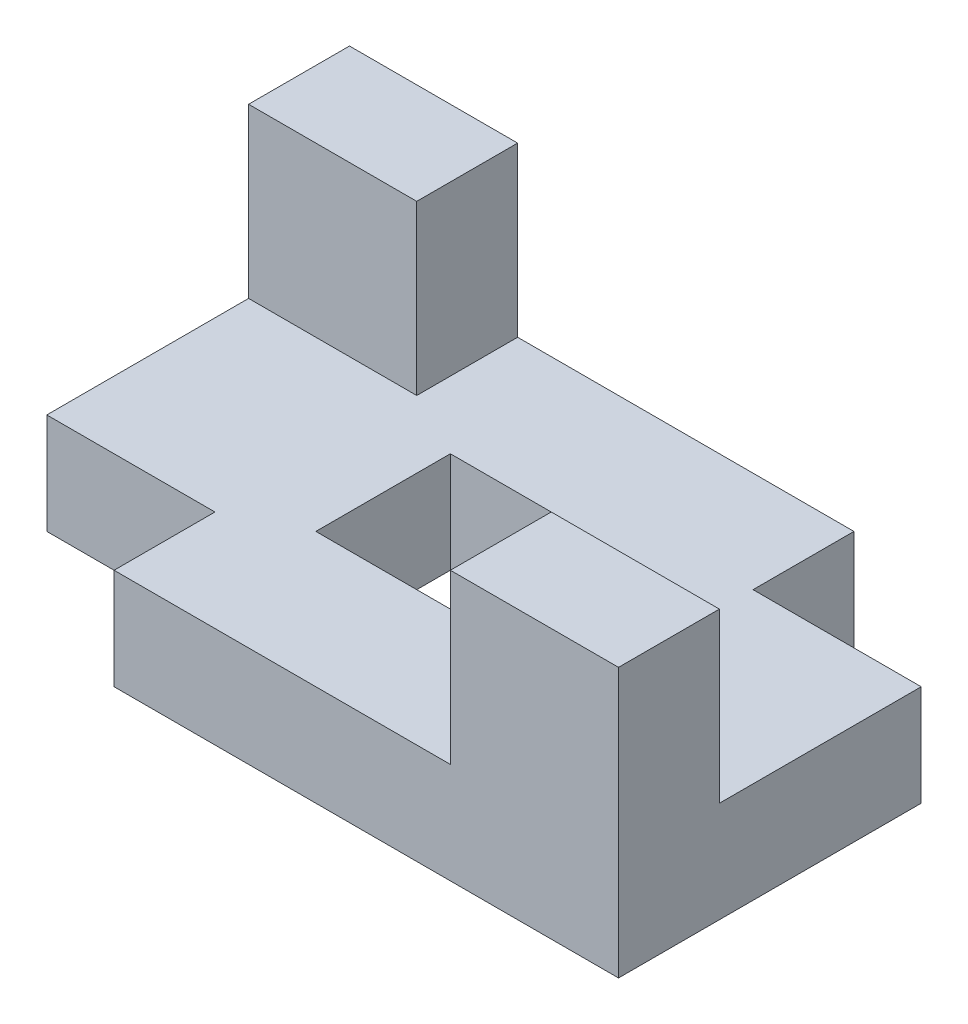
ISO-10303-21;
HEADER;
FILE_DESCRIPTION(('STEP AP214'),'2;1');
FILE_NAME('part.step','',(''),(''),'','','');
FILE_SCHEMA(('AUTOMOTIVE_DESIGN { 1 0 10303 214 1 1 1 1 }'));
ENDSEC;
DATA;
#1=APPLICATION_CONTEXT('core data for automotive mechanical design processes');
#2=APPLICATION_PROTOCOL_DEFINITION('international standard','automotive_design',2000,#1);
#3=PRODUCT_CONTEXT('',#1,'mechanical');
#4=PRODUCT('Part','Part','',(#3));
#5=PRODUCT_RELATED_PRODUCT_CATEGORY('part','',(#4));
#6=PRODUCT_DEFINITION_FORMATION('','',#4);
#7=PRODUCT_DEFINITION_CONTEXT('part definition',#1,'design');
#8=PRODUCT_DEFINITION('design','',#6,#7);
#9=PRODUCT_DEFINITION_SHAPE('','',#8);
#10=(LENGTH_UNIT() NAMED_UNIT(*) SI_UNIT(.MILLI.,.METRE.));
#11=(NAMED_UNIT(*) PLANE_ANGLE_UNIT() SI_UNIT($,.RADIAN.));
#12=(NAMED_UNIT(*) SI_UNIT($,.STERADIAN.) SOLID_ANGLE_UNIT());
#13=UNCERTAINTY_MEASURE_WITH_UNIT(LENGTH_MEASURE(1.E-05),#10,'distance_accuracy_value','');
#14=(GEOMETRIC_REPRESENTATION_CONTEXT(3) GLOBAL_UNCERTAINTY_ASSIGNED_CONTEXT((#13)) GLOBAL_UNIT_ASSIGNED_CONTEXT((#10,
#11,#12)) REPRESENTATION_CONTEXT('',''));
#15=CARTESIAN_POINT('',(0.,0.,0.));
#16=DIRECTION('',(0.,0.,1.));
#17=DIRECTION('',(1.,0.,0.));
#18=AXIS2_PLACEMENT_3D('',#15,#16,#17);
#19=CARTESIAN_POINT('',(0.,15.,0.));
#20=DIRECTION('',(0.,1.,0.));
#21=DIRECTION('',(0.,0.,1.));
#22=AXIS2_PLACEMENT_3D('',#19,#20,#21);
#23=PLANE('',#22);
#24=DIRECTION('',(0.,0.,1.));
#25=VECTOR('',#24,1.);
#26=CARTESIAN_POINT('',(-15.,15.,-9.99999999999999));
#27=LINE('',#26,#25);
#28=CARTESIAN_POINT('',(-15.,15.,-9.99999999999999));
#29=VERTEX_POINT('',#28);
#30=CARTESIAN_POINT('',(-15.,15.,10.));
#31=VERTEX_POINT('',#30);
#32=EDGE_CURVE('E61',#29,#31,#27,.T.);
#33=ORIENTED_EDGE('',*,*,#32,.F.);
#34=DIRECTION('',(-1.,0.,0.));
#35=VECTOR('',#34,1.);
#36=CARTESIAN_POINT('',(-15.,15.,-9.99999999999999));
#37=LINE('',#36,#35);
#38=CARTESIAN_POINT('',(15.,15.,-9.99999999999999));
#39=VERTEX_POINT('',#38);
#40=EDGE_CURVE('E191',#39,#29,#37,.T.);
#41=ORIENTED_EDGE('',*,*,#40,.F.);
#42=DIRECTION('',(0.,0.,-1.));
#43=VECTOR('',#42,1.);
#44=CARTESIAN_POINT('',(15.,15.,-9.99999999999999));
#45=LINE('',#44,#43);
#46=CARTESIAN_POINT('',(15.,15.,10.));
#47=VERTEX_POINT('',#46);
#48=EDGE_CURVE('E174',#47,#39,#45,.T.);
#49=ORIENTED_EDGE('',*,*,#48,.F.);
#50=DIRECTION('',(1.,0.,0.));
#51=VECTOR('',#50,1.);
#52=CARTESIAN_POINT('',(-15.,15.,10.));
#53=LINE('',#52,#51);
#54=EDGE_CURVE('E184',#31,#47,#53,.T.);
#55=ORIENTED_EDGE('',*,*,#54,.F.);
#56=EDGE_LOOP('',(#33,#41,#49,#55));
#57=FACE_BOUND('',#56,.T.);
#58=DIRECTION('',(0.,0.,-1.));
#59=VECTOR('',#58,1.);
#60=CARTESIAN_POINT('',(50.,15.,-30.));
#61=LINE('',#60,#59);
#62=CARTESIAN_POINT('',(50.,15.,15.));
#63=VERTEX_POINT('',#62);
#64=CARTESIAN_POINT('',(50.,15.,-15.));
#65=VERTEX_POINT('',#64);
#66=EDGE_CURVE('E320',#63,#65,#61,.T.);
#67=ORIENTED_EDGE('',*,*,#66,.T.);
#68=DIRECTION('',(-1.,0.,0.));
#69=VECTOR('',#68,1.);
#70=CARTESIAN_POINT('',(50.,15.,-15.));
#71=LINE('',#70,#69);
#72=CARTESIAN_POINT('',(25.,15.,-15.));
#73=VERTEX_POINT('',#72);
#74=EDGE_CURVE('E209',#65,#73,#71,.T.);
#75=ORIENTED_EDGE('',*,*,#74,.T.);
#76=DIRECTION('',(0.,0.,1.));
#77=VECTOR('',#76,1.);
#78=CARTESIAN_POINT('',(25.,15.,-30.));
#79=LINE('',#78,#77);
#80=CARTESIAN_POINT('',(25.,15.,-30.));
#81=VERTEX_POINT('',#80);
#82=EDGE_CURVE('E201',#81,#73,#79,.T.);
#83=ORIENTED_EDGE('',*,*,#82,.F.);
#84=DIRECTION('',(-1.,0.,0.));
#85=VECTOR('',#84,1.);
#86=CARTESIAN_POINT('',(-50.,15.,-30.));
#87=LINE('',#86,#85);
#88=CARTESIAN_POINT('',(-25.,15.,-30.));
#89=VERTEX_POINT('',#88);
#90=EDGE_CURVE('E324',#81,#89,#87,.T.);
#91=ORIENTED_EDGE('',*,*,#90,.T.);
#92=DIRECTION('',(0.,0.,1.));
#93=VECTOR('',#92,1.);
#94=CARTESIAN_POINT('',(-25.,15.,-30.));
#95=LINE('',#94,#93);
#96=CARTESIAN_POINT('',(-25.,15.,-15.));
#97=VERTEX_POINT('',#96);
#98=EDGE_CURVE('E271',#89,#97,#95,.T.);
#99=ORIENTED_EDGE('',*,*,#98,.T.);
#100=DIRECTION('',(1.,0.,0.));
#101=VECTOR('',#100,1.);
#102=CARTESIAN_POINT('',(-50.,15.,-15.));
#103=LINE('',#102,#101);
#104=CARTESIAN_POINT('',(-50.,15.,-15.));
#105=VERTEX_POINT('',#104);
#106=EDGE_CURVE('E284',#105,#97,#103,.T.);
#107=ORIENTED_EDGE('',*,*,#106,.F.);
#108=DIRECTION('',(0.,0.,1.));
#109=VECTOR('',#108,1.);
#110=CARTESIAN_POINT('',(-50.,15.,-30.));
#111=LINE('',#110,#109);
#112=CARTESIAN_POINT('',(-50.,15.,15.));
#113=VERTEX_POINT('',#112);
#114=EDGE_CURVE('E312',#105,#113,#111,.T.);
#115=ORIENTED_EDGE('',*,*,#114,.T.);
#116=DIRECTION('',(1.,0.,0.));
#117=VECTOR('',#116,1.);
#118=CARTESIAN_POINT('',(-50.,15.,15.));
#119=LINE('',#118,#117);
#120=CARTESIAN_POINT('',(-25.,15.,15.));
#121=VERTEX_POINT('',#120);
#122=EDGE_CURVE('E231',#113,#121,#119,.T.);
#123=ORIENTED_EDGE('',*,*,#122,.T.);
#124=DIRECTION('',(0.,0.,-1.));
#125=VECTOR('',#124,1.);
#126=CARTESIAN_POINT('',(-25.,15.,30.));
#127=LINE('',#126,#125);
#128=CARTESIAN_POINT('',(-25.,15.,30.));
#129=VERTEX_POINT('',#128);
#130=EDGE_CURVE('E227',#129,#121,#127,.T.);
#131=ORIENTED_EDGE('',*,*,#130,.F.);
#132=DIRECTION('',(1.,0.,0.));
#133=VECTOR('',#132,1.);
#134=CARTESIAN_POINT('',(-50.,15.,30.));
#135=LINE('',#134,#133);
#136=CARTESIAN_POINT('',(25.,15.,30.));
#137=VERTEX_POINT('',#136);
#138=EDGE_CURVE('E316',#129,#137,#135,.T.);
#139=ORIENTED_EDGE('',*,*,#138,.T.);
#140=DIRECTION('',(0.,0.,-1.));
#141=VECTOR('',#140,1.);
#142=CARTESIAN_POINT('',(25.,15.,30.));
#143=LINE('',#142,#141);
#144=CARTESIAN_POINT('',(25.,15.,15.));
#145=VERTEX_POINT('',#144);
#146=EDGE_CURVE('E240',#137,#145,#143,.T.);
#147=ORIENTED_EDGE('',*,*,#146,.T.);
#148=DIRECTION('',(-1.,0.,0.));
#149=VECTOR('',#148,1.);
#150=CARTESIAN_POINT('',(50.,15.,15.));
#151=LINE('',#150,#149);
#152=EDGE_CURVE('E251',#63,#145,#151,.T.);
#153=ORIENTED_EDGE('',*,*,#152,.F.);
#154=EDGE_LOOP('',(#67,#75,#83,#91,#99,#107,#115,#123,#131,#139,#147,#153));
#155=FACE_BOUND('',#154,.T.);
#156=ADVANCED_FACE('F45',(#57,#155),#23,.T.);
#157=CARTESIAN_POINT('',(0.,0.,0.));
#158=DIRECTION('',(0.,1.,0.));
#159=DIRECTION('',(0.,0.,1.));
#160=AXIS2_PLACEMENT_3D('',#157,#158,#159);
#161=PLANE('',#160);
#162=DIRECTION('',(-1.,0.,0.));
#163=VECTOR('',#162,1.);
#164=CARTESIAN_POINT('',(0.,0.,-9.99999999999999));
#165=LINE('',#164,#163);
#166=CARTESIAN_POINT('',(15.,0.,-9.99999999999999));
#167=VERTEX_POINT('',#166);
#168=CARTESIAN_POINT('',(-15.,0.,-9.99999999999999));
#169=VERTEX_POINT('',#168);
#170=EDGE_CURVE('E54',#167,#169,#165,.T.);
#171=ORIENTED_EDGE('',*,*,#170,.T.);
#172=DIRECTION('',(0.,0.,1.));
#173=VECTOR('',#172,1.);
#174=CARTESIAN_POINT('',(-15.,0.,0.));
#175=LINE('',#174,#173);
#176=CARTESIAN_POINT('',(-15.,0.,10.));
#177=VERTEX_POINT('',#176);
#178=EDGE_CURVE('E11',#169,#177,#175,.T.);
#179=ORIENTED_EDGE('',*,*,#178,.T.);
#180=DIRECTION('',(1.,0.,0.));
#181=VECTOR('',#180,1.);
#182=CARTESIAN_POINT('',(0.,0.,10.));
#183=LINE('',#182,#181);
#184=CARTESIAN_POINT('',(15.,0.,10.));
#185=VERTEX_POINT('',#184);
#186=EDGE_CURVE('E359',#177,#185,#183,.T.);
#187=ORIENTED_EDGE('',*,*,#186,.T.);
#188=DIRECTION('',(0.,0.,-1.));
#189=VECTOR('',#188,1.);
#190=CARTESIAN_POINT('',(15.,0.,0.));
#191=LINE('',#190,#189);
#192=EDGE_CURVE('E177',#185,#167,#191,.T.);
#193=ORIENTED_EDGE('',*,*,#192,.T.);
#194=EDGE_LOOP('',(#171,#179,#187,#193));
#195=FACE_BOUND('',#194,.T.);
#196=DIRECTION('',(-1.,0.,0.));
#197=VECTOR('',#196,1.);
#198=CARTESIAN_POINT('',(0.,0.,-15.));
#199=LINE('',#198,#197);
#200=CARTESIAN_POINT('',(50.,0.,-15.));
#201=VERTEX_POINT('',#200);
#202=CARTESIAN_POINT('',(25.,0.,-15.));
#203=VERTEX_POINT('',#202);
#204=EDGE_CURVE('E224',#201,#203,#199,.T.);
#205=ORIENTED_EDGE('',*,*,#204,.F.);
#206=DIRECTION('',(0.,0.,-1.));
#207=VECTOR('',#206,1.);
#208=CARTESIAN_POINT('',(50.,0.,-30.));
#209=LINE('',#208,#207);
#210=CARTESIAN_POINT('',(50.,0.,30.));
#211=VERTEX_POINT('',#210);
#212=EDGE_CURVE('E334',#211,#201,#209,.T.);
#213=ORIENTED_EDGE('',*,*,#212,.F.);
#214=DIRECTION('',(1.,0.,0.));
#215=VECTOR('',#214,1.);
#216=CARTESIAN_POINT('',(-50.,0.,30.));
#217=LINE('',#216,#215);
#218=CARTESIAN_POINT('',(-25.,0.,30.));
#219=VERTEX_POINT('',#218);
#220=EDGE_CURVE('E331',#219,#211,#217,.T.);
#221=ORIENTED_EDGE('',*,*,#220,.F.);
#222=DIRECTION('',(0.,0.,-1.));
#223=VECTOR('',#222,1.);
#224=CARTESIAN_POINT('',(-25.,0.,0.));
#225=LINE('',#224,#223);
#226=CARTESIAN_POINT('',(-25.,0.,15.));
#227=VERTEX_POINT('',#226);
#228=EDGE_CURVE('E347',#219,#227,#225,.T.);
#229=ORIENTED_EDGE('',*,*,#228,.T.);
#230=DIRECTION('',(1.,0.,0.));
#231=VECTOR('',#230,1.);
#232=CARTESIAN_POINT('',(0.,0.,15.));
#233=LINE('',#232,#231);
#234=CARTESIAN_POINT('',(-50.,0.,15.));
#235=VERTEX_POINT('',#234);
#236=EDGE_CURVE('E351',#235,#227,#233,.T.);
#237=ORIENTED_EDGE('',*,*,#236,.F.);
#238=DIRECTION('',(0.,0.,1.));
#239=VECTOR('',#238,1.);
#240=CARTESIAN_POINT('',(-50.,0.,-30.));
#241=LINE('',#240,#239);
#242=CARTESIAN_POINT('',(-50.,0.,-30.));
#243=VERTEX_POINT('',#242);
#244=EDGE_CURVE('E304',#243,#235,#241,.T.);
#245=ORIENTED_EDGE('',*,*,#244,.F.);
#246=DIRECTION('',(-1.,0.,0.));
#247=VECTOR('',#246,1.);
#248=CARTESIAN_POINT('',(-50.,0.,-30.));
#249=LINE('',#248,#247);
#250=CARTESIAN_POINT('',(25.,0.,-30.));
#251=VERTEX_POINT('',#250);
#252=EDGE_CURVE('E317',#251,#243,#249,.T.);
#253=ORIENTED_EDGE('',*,*,#252,.F.);
#254=DIRECTION('',(0.,0.,1.));
#255=VECTOR('',#254,1.);
#256=CARTESIAN_POINT('',(25.,0.,0.));
#257=LINE('',#256,#255);
#258=EDGE_CURVE('E218',#251,#203,#257,.T.);
#259=ORIENTED_EDGE('',*,*,#258,.T.);
#260=EDGE_LOOP('',(#205,#213,#221,#229,#237,#245,#253,#259));
#261=FACE_BOUND('',#260,.T.);
#262=ADVANCED_FACE('F366',(#195,#261),#161,.F.);
#263=CARTESIAN_POINT('',(50.,15.,-30.));
#264=DIRECTION('',(-1.,0.,0.));
#265=DIRECTION('',(0.,0.,1.));
#266=AXIS2_PLACEMENT_3D('',#263,#264,#265);
#267=PLANE('',#266);
#268=DIRECTION('',(0.,1.,0.));
#269=VECTOR('',#268,1.);
#270=CARTESIAN_POINT('',(50.,-10.,-15.));
#271=LINE('',#270,#269);
#272=EDGE_CURVE('E214',#201,#65,#271,.T.);
#273=ORIENTED_EDGE('',*,*,#272,.T.);
#274=ORIENTED_EDGE('',*,*,#66,.F.);
#275=DIRECTION('',(0.,-1.,0.));
#276=VECTOR('',#275,1.);
#277=CARTESIAN_POINT('',(50.,40.,15.));
#278=LINE('',#277,#276);
#279=CARTESIAN_POINT('',(50.,40.,15.));
#280=VERTEX_POINT('',#279);
#281=EDGE_CURVE('E267',#280,#63,#278,.T.);
#282=ORIENTED_EDGE('',*,*,#281,.F.);
#283=DIRECTION('',(0.,0.,-1.));
#284=VECTOR('',#283,1.);
#285=CARTESIAN_POINT('',(50.,40.,30.));
#286=LINE('',#285,#284);
#287=CARTESIAN_POINT('',(50.,40.,30.));
#288=VERTEX_POINT('',#287);
#289=EDGE_CURVE('E258',#288,#280,#286,.T.);
#290=ORIENTED_EDGE('',*,*,#289,.F.);
#291=DIRECTION('',(0.,-1.,0.));
#292=VECTOR('',#291,1.);
#293=CARTESIAN_POINT('',(50.,15.,30.));
#294=LINE('',#293,#292);
#295=EDGE_CURVE('E343',#288,#211,#294,.T.);
#296=ORIENTED_EDGE('',*,*,#295,.T.);
#297=ORIENTED_EDGE('',*,*,#212,.T.);
#298=EDGE_LOOP('',(#273,#274,#282,#290,#296,#297));
#299=FACE_BOUND('',#298,.T.);
#300=ADVANCED_FACE('F390',(#299),#267,.F.);
#301=CARTESIAN_POINT('',(-50.,15.,-30.));
#302=DIRECTION('',(1.,0.,0.));
#303=DIRECTION('',(0.,0.,-1.));
#304=AXIS2_PLACEMENT_3D('',#301,#302,#303);
#305=PLANE('',#304);
#306=DIRECTION('',(0.,1.,0.));
#307=VECTOR('',#306,1.);
#308=CARTESIAN_POINT('',(-50.,-10.,15.));
#309=LINE('',#308,#307);
#310=EDGE_CURVE('E236',#235,#113,#309,.T.);
#311=ORIENTED_EDGE('',*,*,#310,.T.);
#312=ORIENTED_EDGE('',*,*,#114,.F.);
#313=DIRECTION('',(0.,-1.,0.));
#314=VECTOR('',#313,1.);
#315=CARTESIAN_POINT('',(-50.,40.,-15.));
#316=LINE('',#315,#314);
#317=CARTESIAN_POINT('',(-50.,40.,-15.));
#318=VERTEX_POINT('',#317);
#319=EDGE_CURVE('E300',#318,#105,#316,.T.);
#320=ORIENTED_EDGE('',*,*,#319,.F.);
#321=DIRECTION('',(0.,0.,1.));
#322=VECTOR('',#321,1.);
#323=CARTESIAN_POINT('',(-50.,40.,-30.));
#324=LINE('',#323,#322);
#325=CARTESIAN_POINT('',(-50.,40.,-30.));
#326=VERTEX_POINT('',#325);
#327=EDGE_CURVE('E291',#326,#318,#324,.T.);
#328=ORIENTED_EDGE('',*,*,#327,.F.);
#329=DIRECTION('',(0.,-1.,0.));
#330=VECTOR('',#329,1.);
#331=CARTESIAN_POINT('',(-50.,15.,-30.));
#332=LINE('',#331,#330);
#333=EDGE_CURVE('E327',#326,#243,#332,.T.);
#334=ORIENTED_EDGE('',*,*,#333,.T.);
#335=ORIENTED_EDGE('',*,*,#244,.T.);
#336=EDGE_LOOP('',(#311,#312,#320,#328,#334,#335));
#337=FACE_BOUND('',#336,.T.);
#338=ADVANCED_FACE('F47',(#337),#305,.F.);
#339=CARTESIAN_POINT('',(-50.,15.,30.));
#340=DIRECTION('',(0.,0.,-1.));
#341=DIRECTION('',(-1.,0.,0.));
#342=AXIS2_PLACEMENT_3D('',#339,#340,#341);
#343=PLANE('',#342);
#344=ORIENTED_EDGE('',*,*,#138,.F.);
#345=DIRECTION('',(0.,1.,0.));
#346=VECTOR('',#345,1.);
#347=CARTESIAN_POINT('',(-25.,-10.,30.));
#348=LINE('',#347,#346);
#349=EDGE_CURVE('E235',#219,#129,#348,.T.);
#350=ORIENTED_EDGE('',*,*,#349,.F.);
#351=ORIENTED_EDGE('',*,*,#220,.T.);
#352=ORIENTED_EDGE('',*,*,#295,.F.);
#353=DIRECTION('',(-1.,0.,0.));
#354=VECTOR('',#353,1.);
#355=CARTESIAN_POINT('',(50.,40.,30.));
#356=LINE('',#355,#354);
#357=CARTESIAN_POINT('',(25.,40.,30.));
#358=VERTEX_POINT('',#357);
#359=EDGE_CURVE('E246',#288,#358,#356,.T.);
#360=ORIENTED_EDGE('',*,*,#359,.T.);
#361=DIRECTION('',(0.,-1.,0.));
#362=VECTOR('',#361,1.);
#363=CARTESIAN_POINT('',(25.,40.,30.));
#364=LINE('',#363,#362);
#365=EDGE_CURVE('E261',#358,#137,#364,.T.);
#366=ORIENTED_EDGE('',*,*,#365,.T.);
#367=EDGE_LOOP('',(#344,#350,#351,#352,#360,#366));
#368=FACE_BOUND('',#367,.T.);
#369=ADVANCED_FACE('F400',(#368),#343,.F.);
#370=CARTESIAN_POINT('',(-50.,15.,-30.));
#371=DIRECTION('',(0.,0.,1.));
#372=DIRECTION('',(1.,0.,0.));
#373=AXIS2_PLACEMENT_3D('',#370,#371,#372);
#374=PLANE('',#373);
#375=ORIENTED_EDGE('',*,*,#90,.F.);
#376=DIRECTION('',(0.,-1.,0.));
#377=VECTOR('',#376,1.);
#378=CARTESIAN_POINT('',(25.,15.,-30.));
#379=LINE('',#378,#377);
#380=EDGE_CURVE('E355',#81,#251,#379,.T.);
#381=ORIENTED_EDGE('',*,*,#380,.T.);
#382=ORIENTED_EDGE('',*,*,#252,.T.);
#383=ORIENTED_EDGE('',*,*,#333,.F.);
#384=DIRECTION('',(1.,0.,0.));
#385=VECTOR('',#384,1.);
#386=CARTESIAN_POINT('',(-50.,40.,-30.));
#387=LINE('',#386,#385);
#388=CARTESIAN_POINT('',(-25.,40.,-30.));
#389=VERTEX_POINT('',#388);
#390=EDGE_CURVE('E279',#326,#389,#387,.T.);
#391=ORIENTED_EDGE('',*,*,#390,.T.);
#392=DIRECTION('',(0.,-1.,0.));
#393=VECTOR('',#392,1.);
#394=CARTESIAN_POINT('',(-25.,40.,-30.));
#395=LINE('',#394,#393);
#396=EDGE_CURVE('E294',#389,#89,#395,.T.);
#397=ORIENTED_EDGE('',*,*,#396,.T.);
#398=EDGE_LOOP('',(#375,#381,#382,#383,#391,#397));
#399=FACE_BOUND('',#398,.T.);
#400=ADVANCED_FACE('F396',(#399),#374,.F.);
#401=CARTESIAN_POINT('',(-50.,40.,-15.));
#402=DIRECTION('',(0.,0.,-1.));
#403=DIRECTION('',(-1.,0.,0.));
#404=AXIS2_PLACEMENT_3D('',#401,#402,#403);
#405=PLANE('',#404);
#406=ORIENTED_EDGE('',*,*,#106,.T.);
#407=DIRECTION('',(0.,-1.,0.));
#408=VECTOR('',#407,1.);
#409=CARTESIAN_POINT('',(-25.,40.,-15.));
#410=LINE('',#409,#408);
#411=CARTESIAN_POINT('',(-25.,40.,-15.));
#412=VERTEX_POINT('',#411);
#413=EDGE_CURVE('E305',#412,#97,#410,.T.);
#414=ORIENTED_EDGE('',*,*,#413,.F.);
#415=DIRECTION('',(1.,0.,0.));
#416=VECTOR('',#415,1.);
#417=CARTESIAN_POINT('',(-50.,40.,-15.));
#418=LINE('',#417,#416);
#419=EDGE_CURVE('E288',#318,#412,#418,.T.);
#420=ORIENTED_EDGE('',*,*,#419,.F.);
#421=ORIENTED_EDGE('',*,*,#319,.T.);
#422=EDGE_LOOP('',(#406,#414,#420,#421));
#423=FACE_BOUND('',#422,.T.);
#424=ADVANCED_FACE('F399',(#423),#405,.F.);
#425=CARTESIAN_POINT('',(-25.,40.,-30.));
#426=DIRECTION('',(1.,0.,0.));
#427=DIRECTION('',(0.,0.,-1.));
#428=AXIS2_PLACEMENT_3D('',#425,#426,#427);
#429=PLANE('',#428);
#430=ORIENTED_EDGE('',*,*,#98,.F.);
#431=ORIENTED_EDGE('',*,*,#396,.F.);
#432=DIRECTION('',(0.,0.,1.));
#433=VECTOR('',#432,1.);
#434=CARTESIAN_POINT('',(-25.,40.,-30.));
#435=LINE('',#434,#433);
#436=EDGE_CURVE('E283',#389,#412,#435,.T.);
#437=ORIENTED_EDGE('',*,*,#436,.T.);
#438=ORIENTED_EDGE('',*,*,#413,.T.);
#439=EDGE_LOOP('',(#430,#431,#437,#438));
#440=FACE_BOUND('',#439,.T.);
#441=ADVANCED_FACE('F393',(#440),#429,.T.);
#442=CARTESIAN_POINT('',(0.,40.,0.));
#443=DIRECTION('',(0.,-1.,0.));
#444=DIRECTION('',(0.,0.,-1.));
#445=AXIS2_PLACEMENT_3D('',#442,#443,#444);
#446=PLANE('',#445);
#447=ORIENTED_EDGE('',*,*,#390,.F.);
#448=ORIENTED_EDGE('',*,*,#327,.T.);
#449=ORIENTED_EDGE('',*,*,#419,.T.);
#450=ORIENTED_EDGE('',*,*,#436,.F.);
#451=EDGE_LOOP('',(#447,#448,#449,#450));
#452=FACE_BOUND('',#451,.T.);
#453=ADVANCED_FACE('F462',(#452),#446,.F.);
#454=CARTESIAN_POINT('',(50.,40.,15.));
#455=DIRECTION('',(0.,0.,1.));
#456=DIRECTION('',(1.,0.,0.));
#457=AXIS2_PLACEMENT_3D('',#454,#455,#456);
#458=PLANE('',#457);
#459=ORIENTED_EDGE('',*,*,#152,.T.);
#460=DIRECTION('',(0.,-1.,0.));
#461=VECTOR('',#460,1.);
#462=CARTESIAN_POINT('',(25.,40.,15.));
#463=LINE('',#462,#461);
#464=CARTESIAN_POINT('',(25.,40.,15.));
#465=VERTEX_POINT('',#464);
#466=EDGE_CURVE('E272',#465,#145,#463,.T.);
#467=ORIENTED_EDGE('',*,*,#466,.F.);
#468=DIRECTION('',(-1.,0.,0.));
#469=VECTOR('',#468,1.);
#470=CARTESIAN_POINT('',(50.,40.,15.));
#471=LINE('',#470,#469);
#472=EDGE_CURVE('E255',#280,#465,#471,.T.);
#473=ORIENTED_EDGE('',*,*,#472,.F.);
#474=ORIENTED_EDGE('',*,*,#281,.T.);
#475=EDGE_LOOP('',(#459,#467,#473,#474));
#476=FACE_BOUND('',#475,.T.);
#477=ADVANCED_FACE('F434',(#476),#458,.F.);
#478=CARTESIAN_POINT('',(25.,40.,30.));
#479=DIRECTION('',(-1.,0.,0.));
#480=DIRECTION('',(0.,0.,1.));
#481=AXIS2_PLACEMENT_3D('',#478,#479,#480);
#482=PLANE('',#481);
#483=ORIENTED_EDGE('',*,*,#146,.F.);
#484=ORIENTED_EDGE('',*,*,#365,.F.);
#485=DIRECTION('',(0.,0.,-1.));
#486=VECTOR('',#485,1.);
#487=CARTESIAN_POINT('',(25.,40.,30.));
#488=LINE('',#487,#486);
#489=EDGE_CURVE('E250',#358,#465,#488,.T.);
#490=ORIENTED_EDGE('',*,*,#489,.T.);
#491=ORIENTED_EDGE('',*,*,#466,.T.);
#492=EDGE_LOOP('',(#483,#484,#490,#491));
#493=FACE_BOUND('',#492,.T.);
#494=ADVANCED_FACE('F432',(#493),#482,.T.);
#495=CARTESIAN_POINT('',(0.,40.,0.));
#496=DIRECTION('',(0.,-1.,0.));
#497=DIRECTION('',(0.,0.,-1.));
#498=AXIS2_PLACEMENT_3D('',#495,#496,#497);
#499=PLANE('',#498);
#500=ORIENTED_EDGE('',*,*,#359,.F.);
#501=ORIENTED_EDGE('',*,*,#289,.T.);
#502=ORIENTED_EDGE('',*,*,#472,.T.);
#503=ORIENTED_EDGE('',*,*,#489,.F.);
#504=EDGE_LOOP('',(#500,#501,#502,#503));
#505=FACE_BOUND('',#504,.T.);
#506=ADVANCED_FACE('F429',(#505),#499,.F.);
#507=CARTESIAN_POINT('',(-50.,-10.,15.));
#508=DIRECTION('',(0.,0.,1.));
#509=DIRECTION('',(1.,0.,0.));
#510=AXIS2_PLACEMENT_3D('',#507,#508,#509);
#511=PLANE('',#510);
#512=ORIENTED_EDGE('',*,*,#236,.T.);
#513=DIRECTION('',(0.,1.,0.));
#514=VECTOR('',#513,1.);
#515=CARTESIAN_POINT('',(-25.,-10.,15.));
#516=LINE('',#515,#514);
#517=EDGE_CURVE('E241',#227,#121,#516,.T.);
#518=ORIENTED_EDGE('',*,*,#517,.T.);
#519=ORIENTED_EDGE('',*,*,#122,.F.);
#520=ORIENTED_EDGE('',*,*,#310,.F.);
#521=EDGE_LOOP('',(#512,#518,#519,#520));
#522=FACE_BOUND('',#521,.T.);
#523=ADVANCED_FACE('F451',(#522),#511,.T.);
#524=CARTESIAN_POINT('',(-25.,-10.,30.));
#525=DIRECTION('',(1.,0.,0.));
#526=DIRECTION('',(0.,0.,-1.));
#527=AXIS2_PLACEMENT_3D('',#524,#525,#526);
#528=PLANE('',#527);
#529=ORIENTED_EDGE('',*,*,#349,.T.);
#530=ORIENTED_EDGE('',*,*,#130,.T.);
#531=ORIENTED_EDGE('',*,*,#517,.F.);
#532=ORIENTED_EDGE('',*,*,#228,.F.);
#533=EDGE_LOOP('',(#529,#530,#531,#532));
#534=FACE_BOUND('',#533,.T.);
#535=ADVANCED_FACE('F418',(#534),#528,.F.);
#536=CARTESIAN_POINT('',(50.,-10.,-15.));
#537=DIRECTION('',(0.,0.,-1.));
#538=DIRECTION('',(-1.,0.,0.));
#539=AXIS2_PLACEMENT_3D('',#536,#537,#538);
#540=PLANE('',#539);
#541=ORIENTED_EDGE('',*,*,#204,.T.);
#542=DIRECTION('',(0.,1.,0.));
#543=VECTOR('',#542,1.);
#544=CARTESIAN_POINT('',(25.,-10.,-15.));
#545=LINE('',#544,#543);
#546=EDGE_CURVE('E213',#203,#73,#545,.T.);
#547=ORIENTED_EDGE('',*,*,#546,.T.);
#548=ORIENTED_EDGE('',*,*,#74,.F.);
#549=ORIENTED_EDGE('',*,*,#272,.F.);
#550=EDGE_LOOP('',(#541,#547,#548,#549));
#551=FACE_BOUND('',#550,.T.);
#552=ADVANCED_FACE('F381',(#551),#540,.T.);
#553=CARTESIAN_POINT('',(25.,-10.,-30.));
#554=DIRECTION('',(-1.,0.,0.));
#555=DIRECTION('',(0.,0.,1.));
#556=AXIS2_PLACEMENT_3D('',#553,#554,#555);
#557=PLANE('',#556);
#558=ORIENTED_EDGE('',*,*,#380,.F.);
#559=ORIENTED_EDGE('',*,*,#82,.T.);
#560=ORIENTED_EDGE('',*,*,#546,.F.);
#561=ORIENTED_EDGE('',*,*,#258,.F.);
#562=EDGE_LOOP('',(#558,#559,#560,#561));
#563=FACE_BOUND('',#562,.T.);
#564=ADVANCED_FACE('F373',(#563),#557,.F.);
#565=CARTESIAN_POINT('',(-15.,-10.,-9.99999999999999));
#566=DIRECTION('',(-1.,0.,0.));
#567=DIRECTION('',(0.,0.,1.));
#568=AXIS2_PLACEMENT_3D('',#565,#566,#567);
#569=PLANE('',#568);
#570=DIRECTION('',(0.,1.,0.));
#571=VECTOR('',#570,1.);
#572=CARTESIAN_POINT('',(-15.,-10.,-9.99999999999999));
#573=LINE('',#572,#571);
#574=EDGE_CURVE('E198',#169,#29,#573,.T.);
#575=ORIENTED_EDGE('',*,*,#574,.T.);
#576=ORIENTED_EDGE('',*,*,#32,.T.);
#577=DIRECTION('',(0.,1.,0.));
#578=VECTOR('',#577,1.);
#579=CARTESIAN_POINT('',(-15.,-10.,10.));
#580=LINE('',#579,#578);
#581=EDGE_CURVE('E181',#177,#31,#580,.T.);
#582=ORIENTED_EDGE('',*,*,#581,.F.);
#583=ORIENTED_EDGE('',*,*,#178,.F.);
#584=EDGE_LOOP('',(#575,#576,#582,#583));
#585=FACE_BOUND('',#584,.T.);
#586=ADVANCED_FACE('F371',(#585),#569,.F.);
#587=CARTESIAN_POINT('',(-15.,-10.,-9.99999999999999));
#588=DIRECTION('',(0.,0.,-1.));
#589=DIRECTION('',(-1.,0.,0.));
#590=AXIS2_PLACEMENT_3D('',#587,#588,#589);
#591=PLANE('',#590);
#592=DIRECTION('',(0.,1.,0.));
#593=VECTOR('',#592,1.);
#594=CARTESIAN_POINT('',(15.,-10.,-9.99999999999999));
#595=LINE('',#594,#593);
#596=EDGE_CURVE('E180',#167,#39,#595,.T.);
#597=ORIENTED_EDGE('',*,*,#596,.T.);
#598=ORIENTED_EDGE('',*,*,#40,.T.);
#599=ORIENTED_EDGE('',*,*,#574,.F.);
#600=ORIENTED_EDGE('',*,*,#170,.F.);
#601=EDGE_LOOP('',(#597,#598,#599,#600));
#602=FACE_BOUND('',#601,.T.);
#603=ADVANCED_FACE('F370',(#602),#591,.F.);
#604=CARTESIAN_POINT('',(15.,-10.,-9.99999999999999));
#605=DIRECTION('',(1.,0.,0.));
#606=DIRECTION('',(0.,0.,-1.));
#607=AXIS2_PLACEMENT_3D('',#604,#605,#606);
#608=PLANE('',#607);
#609=DIRECTION('',(0.,1.,0.));
#610=VECTOR('',#609,1.);
#611=CARTESIAN_POINT('',(15.,-10.,10.));
#612=LINE('',#611,#610);
#613=EDGE_CURVE('E69',#185,#47,#612,.T.);
#614=ORIENTED_EDGE('',*,*,#613,.T.);
#615=ORIENTED_EDGE('',*,*,#48,.T.);
#616=ORIENTED_EDGE('',*,*,#596,.F.);
#617=ORIENTED_EDGE('',*,*,#192,.F.);
#618=EDGE_LOOP('',(#614,#615,#616,#617));
#619=FACE_BOUND('',#618,.T.);
#620=ADVANCED_FACE('F171',(#619),#608,.F.);
#621=CARTESIAN_POINT('',(-15.,-10.,10.));
#622=DIRECTION('',(0.,0.,1.));
#623=DIRECTION('',(1.,0.,0.));
#624=AXIS2_PLACEMENT_3D('',#621,#622,#623);
#625=PLANE('',#624);
#626=ORIENTED_EDGE('',*,*,#581,.T.);
#627=ORIENTED_EDGE('',*,*,#54,.T.);
#628=ORIENTED_EDGE('',*,*,#613,.F.);
#629=ORIENTED_EDGE('',*,*,#186,.F.);
#630=EDGE_LOOP('',(#626,#627,#628,#629));
#631=FACE_BOUND('',#630,.T.);
#632=ADVANCED_FACE('F185',(#631),#625,.F.);
#633=CLOSED_SHELL('',(#156,#262,#300,#338,#369,#400,#424,#441,#453,#477,#494,#506,#523,#535,
#552,#564,#586,#603,#620,#632));
#634=MANIFOLD_SOLID_BREP('B2',#633);
#635=ADVANCED_BREP_SHAPE_REPRESENTATION('',(#18,#634),#14);
#636=SHAPE_DEFINITION_REPRESENTATION(#9,#635);
ENDSEC;
END-ISO-10303-21;
